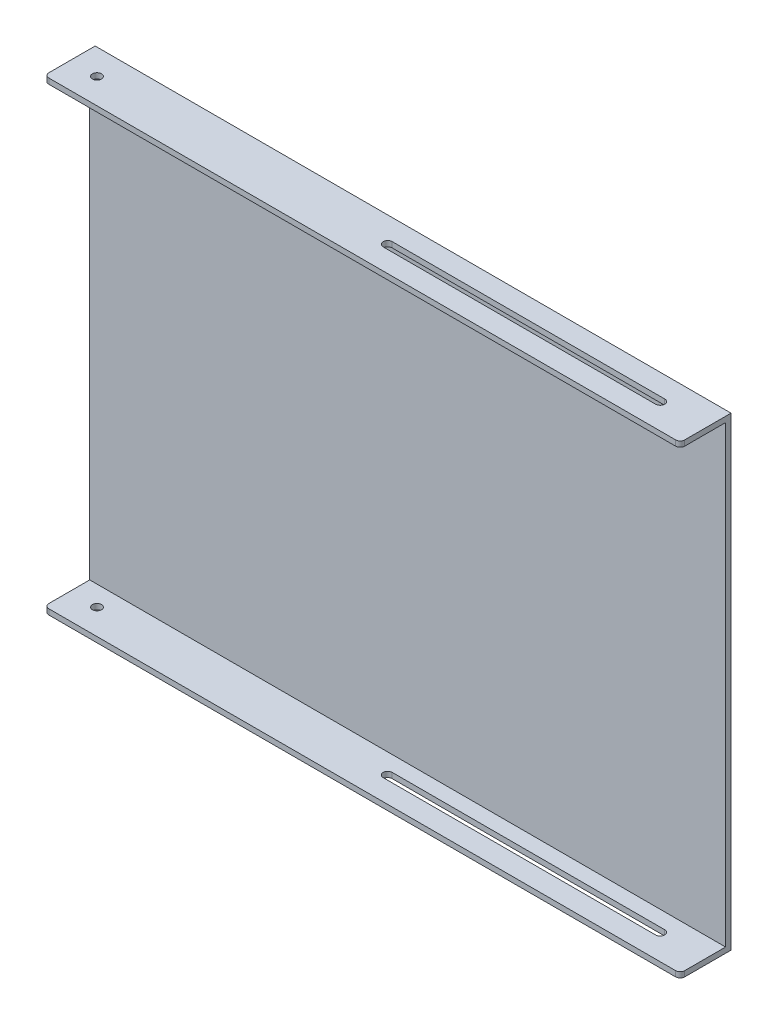
ISO-10303-21;
HEADER;
FILE_DESCRIPTION(('STEP AP214'),'2;1');
FILE_NAME('part.step','',(''),(''),'','','');
FILE_SCHEMA(('AUTOMOTIVE_DESIGN { 1 0 10303 214 1 1 1 1 }'));
ENDSEC;
DATA;
#1=APPLICATION_CONTEXT('core data for automotive mechanical design processes');
#2=APPLICATION_PROTOCOL_DEFINITION('international standard','automotive_design',2000,#1);
#3=PRODUCT_CONTEXT('',#1,'mechanical');
#4=PRODUCT('Part','Part','',(#3));
#5=PRODUCT_RELATED_PRODUCT_CATEGORY('part','',(#4));
#6=PRODUCT_DEFINITION_FORMATION('','',#4);
#7=PRODUCT_DEFINITION_CONTEXT('part definition',#1,'design');
#8=PRODUCT_DEFINITION('design','',#6,#7);
#9=PRODUCT_DEFINITION_SHAPE('','',#8);
#10=(LENGTH_UNIT() NAMED_UNIT(*) SI_UNIT(.MILLI.,.METRE.));
#11=(NAMED_UNIT(*) PLANE_ANGLE_UNIT() SI_UNIT($,.RADIAN.));
#12=(NAMED_UNIT(*) SI_UNIT($,.STERADIAN.) SOLID_ANGLE_UNIT());
#13=UNCERTAINTY_MEASURE_WITH_UNIT(LENGTH_MEASURE(1.E-05),#10,'distance_accuracy_value','');
#14=(GEOMETRIC_REPRESENTATION_CONTEXT(3) GLOBAL_UNCERTAINTY_ASSIGNED_CONTEXT((#13)) GLOBAL_UNIT_ASSIGNED_CONTEXT((#10,
#11,#12)) REPRESENTATION_CONTEXT('',''));
#15=CARTESIAN_POINT('',(0.,0.,0.));
#16=DIRECTION('',(0.,0.,1.));
#17=DIRECTION('',(1.,0.,0.));
#18=AXIS2_PLACEMENT_3D('',#15,#16,#17);
#19=CARTESIAN_POINT('',(-345.,256.,23.));
#20=DIRECTION('',(0.,-1.,0.));
#21=DIRECTION('',(0.,0.,-1.));
#22=AXIS2_PLACEMENT_3D('',#19,#20,#21);
#23=CYLINDRICAL_SURFACE('',#22,5.);
#24=DIRECTION('',(0.,-1.,0.));
#25=VECTOR('',#24,1.);
#26=CARTESIAN_POINT('',(-345.,256.,28.));
#27=LINE('',#26,#25);
#28=CARTESIAN_POINT('',(-345.,-250.,27.9999999999999));
#29=VERTEX_POINT('',#28);
#30=CARTESIAN_POINT('',(-345.,-256.,28.));
#31=VERTEX_POINT('',#30);
#32=EDGE_CURVE('E314',#29,#31,#27,.T.);
#33=ORIENTED_EDGE('',*,*,#32,.F.);
#34=CARTESIAN_POINT('',(-345.,-250.,23.));
#35=DIRECTION('',(0.,-1.,0.));
#36=DIRECTION('',(0.,0.,-1.));
#37=AXIS2_PLACEMENT_3D('',#34,#35,#36);
#38=CIRCLE('',#37,5.);
#39=CARTESIAN_POINT('',(-350.,-250.,23.));
#40=VERTEX_POINT('',#39);
#41=EDGE_CURVE('E227',#29,#40,#38,.T.);
#42=ORIENTED_EDGE('',*,*,#41,.T.);
#43=DIRECTION('',(0.,-1.,0.));
#44=VECTOR('',#43,1.);
#45=CARTESIAN_POINT('',(-350.,256.,23.));
#46=LINE('',#45,#44);
#47=CARTESIAN_POINT('',(-350.,-256.,23.));
#48=VERTEX_POINT('',#47);
#49=EDGE_CURVE('E187',#40,#48,#46,.T.);
#50=ORIENTED_EDGE('',*,*,#49,.T.);
#51=CARTESIAN_POINT('',(-345.,-256.,23.));
#52=DIRECTION('',(0.,1.,0.));
#53=DIRECTION('',(0.,0.,-1.));
#54=AXIS2_PLACEMENT_3D('',#51,#52,#53);
#55=CIRCLE('',#54,5.);
#56=EDGE_CURVE('E289',#48,#31,#55,.T.);
#57=ORIENTED_EDGE('',*,*,#56,.T.);
#58=EDGE_LOOP('',(#33,#42,#50,#57));
#59=FACE_BOUND('',#58,.T.);
#60=ADVANCED_FACE('F33',(#59),#23,.T.);
#61=CARTESIAN_POINT('',(-345.,256.,28.));
#62=DIRECTION('',(0.,0.,-1.));
#63=DIRECTION('',(-1.,0.,0.));
#64=AXIS2_PLACEMENT_3D('',#61,#62,#63);
#65=PLANE('',#64);
#66=DIRECTION('',(0.,-1.,0.));
#67=VECTOR('',#66,1.);
#68=CARTESIAN_POINT('',(345.,256.,28.));
#69=LINE('',#68,#67);
#70=CARTESIAN_POINT('',(345.,-250.,27.9999999999999));
#71=VERTEX_POINT('',#70);
#72=CARTESIAN_POINT('',(345.,-256.,28.));
#73=VERTEX_POINT('',#72);
#74=EDGE_CURVE('E310',#71,#73,#69,.T.);
#75=ORIENTED_EDGE('',*,*,#74,.F.);
#76=DIRECTION('',(1.,0.,0.));
#77=VECTOR('',#76,1.);
#78=CARTESIAN_POINT('',(-350.,-250.,27.9999999999999));
#79=LINE('',#78,#77);
#80=EDGE_CURVE('E191',#29,#71,#79,.T.);
#81=ORIENTED_EDGE('',*,*,#80,.F.);
#82=ORIENTED_EDGE('',*,*,#32,.T.);
#83=DIRECTION('',(1.,0.,0.));
#84=VECTOR('',#83,1.);
#85=CARTESIAN_POINT('',(-345.,-256.,28.));
#86=LINE('',#85,#84);
#87=EDGE_CURVE('E292',#31,#73,#86,.T.);
#88=ORIENTED_EDGE('',*,*,#87,.T.);
#89=EDGE_LOOP('',(#75,#81,#82,#88));
#90=FACE_BOUND('',#89,.T.);
#91=ADVANCED_FACE('F348',(#90),#65,.F.);
#92=CARTESIAN_POINT('',(345.,256.,23.));
#93=DIRECTION('',(0.,-1.,0.));
#94=DIRECTION('',(0.,0.,-1.));
#95=AXIS2_PLACEMENT_3D('',#92,#93,#94);
#96=CYLINDRICAL_SURFACE('',#95,5.);
#97=DIRECTION('',(0.,-1.,0.));
#98=VECTOR('',#97,1.);
#99=CARTESIAN_POINT('',(350.,256.,23.));
#100=LINE('',#99,#98);
#101=CARTESIAN_POINT('',(350.,-250.,23.));
#102=VERTEX_POINT('',#101);
#103=CARTESIAN_POINT('',(350.,-256.,23.));
#104=VERTEX_POINT('',#103);
#105=EDGE_CURVE('E306',#102,#104,#100,.T.);
#106=ORIENTED_EDGE('',*,*,#105,.F.);
#107=CARTESIAN_POINT('',(345.,-250.,23.));
#108=DIRECTION('',(0.,-1.,0.));
#109=DIRECTION('',(0.,0.,-1.));
#110=AXIS2_PLACEMENT_3D('',#107,#108,#109);
#111=CIRCLE('',#110,5.);
#112=EDGE_CURVE('E224',#102,#71,#111,.T.);
#113=ORIENTED_EDGE('',*,*,#112,.T.);
#114=ORIENTED_EDGE('',*,*,#74,.T.);
#115=CARTESIAN_POINT('',(345.,-256.,23.));
#116=DIRECTION('',(0.,1.,0.));
#117=DIRECTION('',(0.,0.,1.));
#118=AXIS2_PLACEMENT_3D('',#115,#116,#117);
#119=CIRCLE('',#118,5.);
#120=EDGE_CURVE('E295',#73,#104,#119,.T.);
#121=ORIENTED_EDGE('',*,*,#120,.T.);
#122=EDGE_LOOP('',(#106,#113,#114,#121));
#123=FACE_BOUND('',#122,.T.);
#124=ADVANCED_FACE('F353',(#123),#96,.T.);
#125=CARTESIAN_POINT('',(0.,256.,0.));
#126=DIRECTION('',(0.,-1.,0.));
#127=DIRECTION('',(0.,0.,-1.));
#128=AXIS2_PLACEMENT_3D('',#125,#126,#127);
#129=CYLINDRICAL_SURFACE('',#128,5.);
#130=CARTESIAN_POINT('',(0.,-250.,0.));
#131=DIRECTION('',(0.,-1.,0.));
#132=DIRECTION('',(0.,0.,-1.));
#133=AXIS2_PLACEMENT_3D('',#130,#131,#132);
#134=CIRCLE('',#133,5.);
#135=CARTESIAN_POINT('',(0.,-250.,5.));
#136=VERTEX_POINT('',#135);
#137=CARTESIAN_POINT('',(0.,-250.,-5.));
#138=VERTEX_POINT('',#137);
#139=EDGE_CURVE('E56',#136,#138,#134,.T.);
#140=ORIENTED_EDGE('',*,*,#139,.F.);
#141=DIRECTION('',(0.,-1.,0.));
#142=VECTOR('',#141,1.);
#143=CARTESIAN_POINT('',(0.,256.,5.));
#144=LINE('',#143,#142);
#145=CARTESIAN_POINT('',(0.,-256.,5.));
#146=VERTEX_POINT('',#145);
#147=EDGE_CURVE('E268',#136,#146,#144,.T.);
#148=ORIENTED_EDGE('',*,*,#147,.T.);
#149=CARTESIAN_POINT('',(0.,-256.,0.));
#150=DIRECTION('',(0.,1.,0.));
#151=DIRECTION('',(0.,0.,1.));
#152=AXIS2_PLACEMENT_3D('',#149,#150,#151);
#153=CIRCLE('',#152,5.);
#154=CARTESIAN_POINT('',(0.,-256.,-5.));
#155=VERTEX_POINT('',#154);
#156=EDGE_CURVE('E233',#155,#146,#153,.T.);
#157=ORIENTED_EDGE('',*,*,#156,.F.);
#158=DIRECTION('',(0.,-1.,0.));
#159=VECTOR('',#158,1.);
#160=CARTESIAN_POINT('',(0.,256.,-5.));
#161=LINE('',#160,#159);
#162=EDGE_CURVE('E246',#138,#155,#161,.T.);
#163=ORIENTED_EDGE('',*,*,#162,.F.);
#164=EDGE_LOOP('',(#140,#148,#157,#163));
#165=FACE_BOUND('',#164,.T.);
#166=ADVANCED_FACE('F405',(#165),#129,.F.);
#167=CARTESIAN_POINT('',(0.,256.,5.));
#168=DIRECTION('',(0.,0.,-1.));
#169=DIRECTION('',(-1.,0.,0.));
#170=AXIS2_PLACEMENT_3D('',#167,#168,#169);
#171=PLANE('',#170);
#172=DIRECTION('',(-1.,0.,0.));
#173=VECTOR('',#172,1.);
#174=CARTESIAN_POINT('',(0.,-250.,5.));
#175=LINE('',#174,#173);
#176=CARTESIAN_POINT('',(300.,-250.,5.));
#177=VERTEX_POINT('',#176);
#178=EDGE_CURVE('E220',#177,#136,#175,.T.);
#179=ORIENTED_EDGE('',*,*,#178,.F.);
#180=DIRECTION('',(0.,-1.,0.));
#181=VECTOR('',#180,1.);
#182=CARTESIAN_POINT('',(300.,256.,5.));
#183=LINE('',#182,#181);
#184=CARTESIAN_POINT('',(300.,-256.,5.));
#185=VERTEX_POINT('',#184);
#186=EDGE_CURVE('E264',#177,#185,#183,.T.);
#187=ORIENTED_EDGE('',*,*,#186,.T.);
#188=DIRECTION('',(1.,0.,0.));
#189=VECTOR('',#188,1.);
#190=CARTESIAN_POINT('',(0.,-256.,5.));
#191=LINE('',#190,#189);
#192=EDGE_CURVE('E249',#146,#185,#191,.T.);
#193=ORIENTED_EDGE('',*,*,#192,.F.);
#194=ORIENTED_EDGE('',*,*,#147,.F.);
#195=EDGE_LOOP('',(#179,#187,#193,#194));
#196=FACE_BOUND('',#195,.T.);
#197=ADVANCED_FACE('F409',(#196),#171,.T.);
#198=CARTESIAN_POINT('',(300.,256.,0.));
#199=DIRECTION('',(0.,-1.,0.));
#200=DIRECTION('',(0.,0.,-1.));
#201=AXIS2_PLACEMENT_3D('',#198,#199,#200);
#202=CYLINDRICAL_SURFACE('',#201,5.);
#203=CARTESIAN_POINT('',(300.,-250.,0.));
#204=DIRECTION('',(0.,-1.,0.));
#205=DIRECTION('',(0.,0.,-1.));
#206=AXIS2_PLACEMENT_3D('',#203,#204,#205);
#207=CIRCLE('',#206,5.);
#208=CARTESIAN_POINT('',(300.,-250.,-5.));
#209=VERTEX_POINT('',#208);
#210=EDGE_CURVE('E218',#209,#177,#207,.T.);
#211=ORIENTED_EDGE('',*,*,#210,.F.);
#212=DIRECTION('',(0.,-1.,0.));
#213=VECTOR('',#212,1.);
#214=CARTESIAN_POINT('',(300.,256.,-5.));
#215=LINE('',#214,#213);
#216=CARTESIAN_POINT('',(300.,-256.,-5.));
#217=VERTEX_POINT('',#216);
#218=EDGE_CURVE('E260',#209,#217,#215,.T.);
#219=ORIENTED_EDGE('',*,*,#218,.T.);
#220=CARTESIAN_POINT('',(300.,-256.,0.));
#221=DIRECTION('',(0.,1.,0.));
#222=DIRECTION('',(0.,0.,1.));
#223=AXIS2_PLACEMENT_3D('',#220,#221,#222);
#224=CIRCLE('',#223,5.);
#225=EDGE_CURVE('E252',#185,#217,#224,.T.);
#226=ORIENTED_EDGE('',*,*,#225,.F.);
#227=ORIENTED_EDGE('',*,*,#186,.F.);
#228=EDGE_LOOP('',(#211,#219,#226,#227));
#229=FACE_BOUND('',#228,.T.);
#230=ADVANCED_FACE('F415',(#229),#202,.F.);
#231=CARTESIAN_POINT('',(0.,256.,-5.));
#232=DIRECTION('',(0.,0.,1.));
#233=DIRECTION('',(1.,0.,0.));
#234=AXIS2_PLACEMENT_3D('',#231,#232,#233);
#235=PLANE('',#234);
#236=DIRECTION('',(1.,0.,0.));
#237=VECTOR('',#236,1.);
#238=CARTESIAN_POINT('',(0.,-250.,-5.));
#239=LINE('',#238,#237);
#240=EDGE_CURVE('E216',#138,#209,#239,.T.);
#241=ORIENTED_EDGE('',*,*,#240,.F.);
#242=ORIENTED_EDGE('',*,*,#162,.T.);
#243=DIRECTION('',(-1.,0.,0.));
#244=VECTOR('',#243,1.);
#245=CARTESIAN_POINT('',(0.,-256.,-5.));
#246=LINE('',#245,#244);
#247=EDGE_CURVE('E239',#217,#155,#246,.T.);
#248=ORIENTED_EDGE('',*,*,#247,.F.);
#249=ORIENTED_EDGE('',*,*,#218,.F.);
#250=EDGE_LOOP('',(#241,#242,#248,#249));
#251=FACE_BOUND('',#250,.T.);
#252=ADVANCED_FACE('F329',(#251),#235,.T.);
#253=CARTESIAN_POINT('',(-320.,256.,0.));
#254=DIRECTION('',(0.,-1.,0.));
#255=DIRECTION('',(0.,0.,-1.));
#256=AXIS2_PLACEMENT_3D('',#253,#254,#255);
#257=CYLINDRICAL_SURFACE('',#256,4.99999999999999);
#258=CARTESIAN_POINT('',(-320.,-250.,0.));
#259=DIRECTION('',(0.,-1.,0.));
#260=DIRECTION('',(0.,0.,-1.));
#261=AXIS2_PLACEMENT_3D('',#258,#259,#260);
#262=CIRCLE('',#261,4.99999999999999);
#263=CARTESIAN_POINT('',(-320.,-250.,-4.99999999999999));
#264=VERTEX_POINT('',#263);
#265=EDGE_CURVE('E215',#264,#264,#262,.T.);
#266=ORIENTED_EDGE('',*,*,#265,.F.);
#267=EDGE_LOOP('',(#266));
#268=FACE_BOUND('',#267,.T.);
#269=CARTESIAN_POINT('',(-320.,-256.,0.));
#270=DIRECTION('',(0.,1.,0.));
#271=DIRECTION('',(0.,0.,1.));
#272=AXIS2_PLACEMENT_3D('',#269,#270,#271);
#273=CIRCLE('',#272,4.99999999999999);
#274=CARTESIAN_POINT('',(-320.,-256.,4.99999999999999));
#275=VERTEX_POINT('',#274);
#276=EDGE_CURVE('E229',#275,#275,#273,.T.);
#277=ORIENTED_EDGE('',*,*,#276,.F.);
#278=EDGE_LOOP('',(#277));
#279=FACE_BOUND('',#278,.T.);
#280=ADVANCED_FACE('F325',(#268,#279),#257,.F.);
#281=CARTESIAN_POINT('',(-345.,256.,23.));
#282=DIRECTION('',(0.,-1.,0.));
#283=DIRECTION('',(0.,0.,-1.));
#284=AXIS2_PLACEMENT_3D('',#281,#282,#283);
#285=PLANE('',#284);
#286=DIRECTION('',(0.,0.,1.));
#287=VECTOR('',#286,1.);
#288=CARTESIAN_POINT('',(-350.,256.,-28.));
#289=LINE('',#288,#287);
#290=CARTESIAN_POINT('',(-350.,256.,-28.));
#291=VERTEX_POINT('',#290);
#292=CARTESIAN_POINT('',(-350.,256.,23.));
#293=VERTEX_POINT('',#292);
#294=EDGE_CURVE('E273',#291,#293,#289,.T.);
#295=ORIENTED_EDGE('',*,*,#294,.T.);
#296=CARTESIAN_POINT('',(-345.,256.,23.));
#297=DIRECTION('',(0.,1.,0.));
#298=DIRECTION('',(0.,0.,-1.));
#299=AXIS2_PLACEMENT_3D('',#296,#297,#298);
#300=CIRCLE('',#299,5.);
#301=CARTESIAN_POINT('',(-345.,256.,28.));
#302=VERTEX_POINT('',#301);
#303=EDGE_CURVE('E276',#293,#302,#300,.T.);
#304=ORIENTED_EDGE('',*,*,#303,.T.);
#305=DIRECTION('',(1.,0.,0.));
#306=VECTOR('',#305,1.);
#307=CARTESIAN_POINT('',(-345.,256.,28.));
#308=LINE('',#307,#306);
#309=CARTESIAN_POINT('',(345.,256.,28.));
#310=VERTEX_POINT('',#309);
#311=EDGE_CURVE('E279',#302,#310,#308,.T.);
#312=ORIENTED_EDGE('',*,*,#311,.T.);
#313=CARTESIAN_POINT('',(345.,256.,23.));
#314=DIRECTION('',(0.,1.,0.));
#315=DIRECTION('',(0.,0.,1.));
#316=AXIS2_PLACEMENT_3D('',#313,#314,#315);
#317=CIRCLE('',#316,5.);
#318=CARTESIAN_POINT('',(350.,256.,23.));
#319=VERTEX_POINT('',#318);
#320=EDGE_CURVE('E281',#310,#319,#317,.T.);
#321=ORIENTED_EDGE('',*,*,#320,.T.);
#322=DIRECTION('',(0.,0.,-1.));
#323=VECTOR('',#322,1.);
#324=CARTESIAN_POINT('',(350.,256.,-28.));
#325=LINE('',#324,#323);
#326=CARTESIAN_POINT('',(350.,256.,-28.));
#327=VERTEX_POINT('',#326);
#328=EDGE_CURVE('E283',#319,#327,#325,.T.);
#329=ORIENTED_EDGE('',*,*,#328,.T.);
#330=DIRECTION('',(-1.,0.,0.));
#331=VECTOR('',#330,1.);
#332=CARTESIAN_POINT('',(-350.,256.,-28.));
#333=LINE('',#332,#331);
#334=EDGE_CURVE('E285',#327,#291,#333,.T.);
#335=ORIENTED_EDGE('',*,*,#334,.T.);
#336=EDGE_LOOP('',(#295,#304,#312,#321,#329,#335));
#337=FACE_BOUND('',#336,.T.);
#338=CARTESIAN_POINT('',(0.,256.,0.));
#339=DIRECTION('',(0.,1.,0.));
#340=DIRECTION('',(0.,0.,1.));
#341=AXIS2_PLACEMENT_3D('',#338,#339,#340);
#342=CIRCLE('',#341,5.);
#343=CARTESIAN_POINT('',(0.,256.,-5.));
#344=VERTEX_POINT('',#343);
#345=CARTESIAN_POINT('',(0.,256.,5.));
#346=VERTEX_POINT('',#345);
#347=EDGE_CURVE('E236',#344,#346,#342,.T.);
#348=ORIENTED_EDGE('',*,*,#347,.F.);
#349=DIRECTION('',(-1.,0.,0.));
#350=VECTOR('',#349,1.);
#351=CARTESIAN_POINT('',(0.,256.,-5.));
#352=LINE('',#351,#350);
#353=CARTESIAN_POINT('',(300.,256.,-5.));
#354=VERTEX_POINT('',#353);
#355=EDGE_CURVE('E244',#354,#344,#352,.T.);
#356=ORIENTED_EDGE('',*,*,#355,.F.);
#357=CARTESIAN_POINT('',(300.,256.,0.));
#358=DIRECTION('',(0.,1.,0.));
#359=DIRECTION('',(0.,0.,1.));
#360=AXIS2_PLACEMENT_3D('',#357,#358,#359);
#361=CIRCLE('',#360,5.);
#362=CARTESIAN_POINT('',(300.,256.,5.));
#363=VERTEX_POINT('',#362);
#364=EDGE_CURVE('E241',#363,#354,#361,.T.);
#365=ORIENTED_EDGE('',*,*,#364,.F.);
#366=DIRECTION('',(1.,0.,0.));
#367=VECTOR('',#366,1.);
#368=CARTESIAN_POINT('',(0.,256.,5.));
#369=LINE('',#368,#367);
#370=EDGE_CURVE('E238',#346,#363,#369,.T.);
#371=ORIENTED_EDGE('',*,*,#370,.F.);
#372=EDGE_LOOP('',(#348,#356,#365,#371));
#373=FACE_BOUND('',#372,.T.);
#374=CARTESIAN_POINT('',(-320.,256.,0.));
#375=DIRECTION('',(0.,1.,0.));
#376=DIRECTION('',(0.,0.,1.));
#377=AXIS2_PLACEMENT_3D('',#374,#375,#376);
#378=CIRCLE('',#377,4.99999999999999);
#379=CARTESIAN_POINT('',(-320.,256.,4.99999999999999));
#380=VERTEX_POINT('',#379);
#381=EDGE_CURVE('E230',#380,#380,#378,.T.);
#382=ORIENTED_EDGE('',*,*,#381,.F.);
#383=EDGE_LOOP('',(#382));
#384=FACE_BOUND('',#383,.T.);
#385=ADVANCED_FACE('F328',(#337,#373,#384),#285,.F.);
#386=CARTESIAN_POINT('',(-345.,-256.,23.));
#387=DIRECTION('',(0.,-1.,0.));
#388=DIRECTION('',(0.,0.,-1.));
#389=AXIS2_PLACEMENT_3D('',#386,#387,#388);
#390=PLANE('',#389);
#391=ORIENTED_EDGE('',*,*,#247,.T.);
#392=ORIENTED_EDGE('',*,*,#156,.T.);
#393=ORIENTED_EDGE('',*,*,#192,.T.);
#394=ORIENTED_EDGE('',*,*,#225,.T.);
#395=EDGE_LOOP('',(#391,#392,#393,#394));
#396=FACE_BOUND('',#395,.T.);
#397=DIRECTION('',(0.,0.,1.));
#398=VECTOR('',#397,1.);
#399=CARTESIAN_POINT('',(-350.,-256.,-28.));
#400=LINE('',#399,#398);
#401=CARTESIAN_POINT('',(-350.,-256.,-28.));
#402=VERTEX_POINT('',#401);
#403=EDGE_CURVE('E272',#402,#48,#400,.T.);
#404=ORIENTED_EDGE('',*,*,#403,.F.);
#405=DIRECTION('',(-1.,0.,0.));
#406=VECTOR('',#405,1.);
#407=CARTESIAN_POINT('',(-350.,-256.,-28.));
#408=LINE('',#407,#406);
#409=CARTESIAN_POINT('',(350.,-256.,-28.));
#410=VERTEX_POINT('',#409);
#411=EDGE_CURVE('E277',#410,#402,#408,.T.);
#412=ORIENTED_EDGE('',*,*,#411,.F.);
#413=DIRECTION('',(0.,0.,-1.));
#414=VECTOR('',#413,1.);
#415=CARTESIAN_POINT('',(350.,-256.,-28.));
#416=LINE('',#415,#414);
#417=EDGE_CURVE('E298',#104,#410,#416,.T.);
#418=ORIENTED_EDGE('',*,*,#417,.F.);
#419=ORIENTED_EDGE('',*,*,#120,.F.);
#420=ORIENTED_EDGE('',*,*,#87,.F.);
#421=ORIENTED_EDGE('',*,*,#56,.F.);
#422=EDGE_LOOP('',(#404,#412,#418,#419,#420,#421));
#423=FACE_BOUND('',#422,.T.);
#424=ORIENTED_EDGE('',*,*,#276,.T.);
#425=EDGE_LOOP('',(#424));
#426=FACE_BOUND('',#425,.T.);
#427=ADVANCED_FACE('F334',(#396,#423,#426),#390,.T.);
#428=CARTESIAN_POINT('',(-350.,256.,-28.));
#429=DIRECTION('',(1.,0.,0.));
#430=DIRECTION('',(0.,0.,-1.));
#431=AXIS2_PLACEMENT_3D('',#428,#429,#430);
#432=PLANE('',#431);
#433=ORIENTED_EDGE('',*,*,#49,.F.);
#434=DIRECTION('',(0.,0.,-1.));
#435=VECTOR('',#434,1.);
#436=CARTESIAN_POINT('',(-350.,-250.,27.9999999999999));
#437=LINE('',#436,#435);
#438=CARTESIAN_POINT('',(-350.,-250.,-22.));
#439=VERTEX_POINT('',#438);
#440=EDGE_CURVE('E170',#40,#439,#437,.T.);
#441=ORIENTED_EDGE('',*,*,#440,.T.);
#442=DIRECTION('',(0.,1.,0.));
#443=VECTOR('',#442,1.);
#444=CARTESIAN_POINT('',(-350.,-250.,-22.));
#445=LINE('',#444,#443);
#446=CARTESIAN_POINT('',(-350.,250.,-22.));
#447=VERTEX_POINT('',#446);
#448=EDGE_CURVE('E178',#439,#447,#445,.T.);
#449=ORIENTED_EDGE('',*,*,#448,.T.);
#450=DIRECTION('',(0.,0.,1.));
#451=VECTOR('',#450,1.);
#452=CARTESIAN_POINT('',(-350.,250.,-22.));
#453=LINE('',#452,#451);
#454=CARTESIAN_POINT('',(-350.,250.,23.));
#455=VERTEX_POINT('',#454);
#456=EDGE_CURVE('E175',#447,#455,#453,.T.);
#457=ORIENTED_EDGE('',*,*,#456,.T.);
#458=EDGE_CURVE('E41',#293,#455,#46,.T.);
#459=ORIENTED_EDGE('',*,*,#458,.F.);
#460=ORIENTED_EDGE('',*,*,#294,.F.);
#461=DIRECTION('',(0.,-1.,0.));
#462=VECTOR('',#461,1.);
#463=CARTESIAN_POINT('',(-350.,256.,-28.));
#464=LINE('',#463,#462);
#465=EDGE_CURVE('E287',#291,#402,#464,.T.);
#466=ORIENTED_EDGE('',*,*,#465,.T.);
#467=ORIENTED_EDGE('',*,*,#403,.T.);
#468=EDGE_LOOP('',(#433,#441,#449,#457,#459,#460,#466,#467));
#469=FACE_BOUND('',#468,.T.);
#470=ADVANCED_FACE('F35',(#469),#432,.F.);
#471=ORIENTED_EDGE('',*,*,#458,.T.);
#472=CARTESIAN_POINT('',(-345.,250.,23.));
#473=DIRECTION('',(0.,1.,0.));
#474=DIRECTION('',(0.,0.,1.));
#475=AXIS2_PLACEMENT_3D('',#472,#473,#474);
#476=CIRCLE('',#475,5.);
#477=CARTESIAN_POINT('',(-345.,250.,28.0000000000001));
#478=VERTEX_POINT('',#477);
#479=EDGE_CURVE('E212',#455,#478,#476,.T.);
#480=ORIENTED_EDGE('',*,*,#479,.T.);
#481=EDGE_CURVE('E315',#302,#478,#27,.T.);
#482=ORIENTED_EDGE('',*,*,#481,.F.);
#483=ORIENTED_EDGE('',*,*,#303,.F.);
#484=EDGE_LOOP('',(#471,#480,#482,#483));
#485=FACE_BOUND('',#484,.T.);
#486=ADVANCED_FACE('F342',(#485),#23,.T.);
#487=ORIENTED_EDGE('',*,*,#481,.T.);
#488=DIRECTION('',(1.,0.,0.));
#489=VECTOR('',#488,1.);
#490=CARTESIAN_POINT('',(-350.,250.,28.0000000000001));
#491=LINE('',#490,#489);
#492=CARTESIAN_POINT('',(345.,250.,28.0000000000001));
#493=VERTEX_POINT('',#492);
#494=EDGE_CURVE('E194',#478,#493,#491,.T.);
#495=ORIENTED_EDGE('',*,*,#494,.T.);
#496=EDGE_CURVE('E311',#310,#493,#69,.T.);
#497=ORIENTED_EDGE('',*,*,#496,.F.);
#498=ORIENTED_EDGE('',*,*,#311,.F.);
#499=EDGE_LOOP('',(#487,#495,#497,#498));
#500=FACE_BOUND('',#499,.T.);
#501=ADVANCED_FACE('F356',(#500),#65,.F.);
#502=ORIENTED_EDGE('',*,*,#496,.T.);
#503=CARTESIAN_POINT('',(345.,250.,23.));
#504=DIRECTION('',(0.,1.,0.));
#505=DIRECTION('',(0.,0.,1.));
#506=AXIS2_PLACEMENT_3D('',#503,#504,#505);
#507=CIRCLE('',#506,5.);
#508=CARTESIAN_POINT('',(350.,250.,23.));
#509=VERTEX_POINT('',#508);
#510=EDGE_CURVE('E209',#493,#509,#507,.T.);
#511=ORIENTED_EDGE('',*,*,#510,.T.);
#512=EDGE_CURVE('E307',#319,#509,#100,.T.);
#513=ORIENTED_EDGE('',*,*,#512,.F.);
#514=ORIENTED_EDGE('',*,*,#320,.F.);
#515=EDGE_LOOP('',(#502,#511,#513,#514));
#516=FACE_BOUND('',#515,.T.);
#517=ADVANCED_FACE('F363',(#516),#96,.T.);
#518=CARTESIAN_POINT('',(350.,256.,-28.));
#519=DIRECTION('',(-1.,0.,0.));
#520=DIRECTION('',(0.,0.,1.));
#521=AXIS2_PLACEMENT_3D('',#518,#519,#520);
#522=PLANE('',#521);
#523=DIRECTION('',(0.,-1.,0.));
#524=VECTOR('',#523,1.);
#525=CARTESIAN_POINT('',(350.,256.,-22.));
#526=LINE('',#525,#524);
#527=CARTESIAN_POINT('',(350.,250.,-22.));
#528=VERTEX_POINT('',#527);
#529=CARTESIAN_POINT('',(350.,-250.,-22.));
#530=VERTEX_POINT('',#529);
#531=EDGE_CURVE('E11',#528,#530,#526,.T.);
#532=ORIENTED_EDGE('',*,*,#531,.T.);
#533=DIRECTION('',(0.,0.,1.));
#534=VECTOR('',#533,1.);
#535=CARTESIAN_POINT('',(350.,-250.,-28.));
#536=LINE('',#535,#534);
#537=EDGE_CURVE('E173',#530,#102,#536,.T.);
#538=ORIENTED_EDGE('',*,*,#537,.T.);
#539=ORIENTED_EDGE('',*,*,#105,.T.);
#540=ORIENTED_EDGE('',*,*,#417,.T.);
#541=DIRECTION('',(0.,-1.,0.));
#542=VECTOR('',#541,1.);
#543=CARTESIAN_POINT('',(350.,256.,-28.));
#544=LINE('',#543,#542);
#545=EDGE_CURVE('E303',#327,#410,#544,.T.);
#546=ORIENTED_EDGE('',*,*,#545,.F.);
#547=ORIENTED_EDGE('',*,*,#328,.F.);
#548=ORIENTED_EDGE('',*,*,#512,.T.);
#549=DIRECTION('',(0.,0.,-1.));
#550=VECTOR('',#549,1.);
#551=CARTESIAN_POINT('',(350.,250.,-28.));
#552=LINE('',#551,#550);
#553=EDGE_CURVE('E206',#509,#528,#552,.T.);
#554=ORIENTED_EDGE('',*,*,#553,.T.);
#555=EDGE_LOOP('',(#532,#538,#539,#540,#546,#547,#548,#554));
#556=FACE_BOUND('',#555,.T.);
#557=ADVANCED_FACE('F393',(#556),#522,.F.);
#558=CARTESIAN_POINT('',(-350.,256.,-28.));
#559=DIRECTION('',(0.,0.,1.));
#560=DIRECTION('',(1.,0.,0.));
#561=AXIS2_PLACEMENT_3D('',#558,#559,#560);
#562=PLANE('',#561);
#563=ORIENTED_EDGE('',*,*,#411,.T.);
#564=ORIENTED_EDGE('',*,*,#465,.F.);
#565=ORIENTED_EDGE('',*,*,#334,.F.);
#566=ORIENTED_EDGE('',*,*,#545,.T.);
#567=EDGE_LOOP('',(#563,#564,#565,#566));
#568=FACE_BOUND('',#567,.T.);
#569=ADVANCED_FACE('F381',(#568),#562,.F.);
#570=CARTESIAN_POINT('',(0.,250.,0.));
#571=DIRECTION('',(0.,1.,0.));
#572=DIRECTION('',(0.,0.,1.));
#573=AXIS2_PLACEMENT_3D('',#570,#571,#572);
#574=CIRCLE('',#573,5.);
#575=CARTESIAN_POINT('',(0.,250.,-5.));
#576=VERTEX_POINT('',#575);
#577=CARTESIAN_POINT('',(0.,250.,5.));
#578=VERTEX_POINT('',#577);
#579=EDGE_CURVE('E204',#576,#578,#574,.T.);
#580=ORIENTED_EDGE('',*,*,#579,.F.);
#581=EDGE_CURVE('E257',#344,#576,#161,.T.);
#582=ORIENTED_EDGE('',*,*,#581,.F.);
#583=ORIENTED_EDGE('',*,*,#347,.T.);
#584=EDGE_CURVE('E269',#346,#578,#144,.T.);
#585=ORIENTED_EDGE('',*,*,#584,.T.);
#586=EDGE_LOOP('',(#580,#582,#583,#585));
#587=FACE_BOUND('',#586,.T.);
#588=ADVANCED_FACE('F400',(#587),#129,.F.);
#589=DIRECTION('',(1.,0.,0.));
#590=VECTOR('',#589,1.);
#591=CARTESIAN_POINT('',(0.,250.,5.));
#592=LINE('',#591,#590);
#593=CARTESIAN_POINT('',(300.,250.,5.));
#594=VERTEX_POINT('',#593);
#595=EDGE_CURVE('E202',#578,#594,#592,.T.);
#596=ORIENTED_EDGE('',*,*,#595,.F.);
#597=ORIENTED_EDGE('',*,*,#584,.F.);
#598=ORIENTED_EDGE('',*,*,#370,.T.);
#599=EDGE_CURVE('E265',#363,#594,#183,.T.);
#600=ORIENTED_EDGE('',*,*,#599,.T.);
#601=EDGE_LOOP('',(#596,#597,#598,#600));
#602=FACE_BOUND('',#601,.T.);
#603=ADVANCED_FACE('F418',(#602),#171,.T.);
#604=CARTESIAN_POINT('',(300.,250.,0.));
#605=DIRECTION('',(0.,1.,0.));
#606=DIRECTION('',(0.,0.,1.));
#607=AXIS2_PLACEMENT_3D('',#604,#605,#606);
#608=CIRCLE('',#607,5.);
#609=CARTESIAN_POINT('',(300.,250.,-5.));
#610=VERTEX_POINT('',#609);
#611=EDGE_CURVE('E200',#594,#610,#608,.T.);
#612=ORIENTED_EDGE('',*,*,#611,.F.);
#613=ORIENTED_EDGE('',*,*,#599,.F.);
#614=ORIENTED_EDGE('',*,*,#364,.T.);
#615=EDGE_CURVE('E261',#354,#610,#215,.T.);
#616=ORIENTED_EDGE('',*,*,#615,.T.);
#617=EDGE_LOOP('',(#612,#613,#614,#616));
#618=FACE_BOUND('',#617,.T.);
#619=ADVANCED_FACE('F424',(#618),#202,.F.);
#620=DIRECTION('',(-1.,0.,0.));
#621=VECTOR('',#620,1.);
#622=CARTESIAN_POINT('',(0.,250.,-5.));
#623=LINE('',#622,#621);
#624=EDGE_CURVE('E198',#610,#576,#623,.T.);
#625=ORIENTED_EDGE('',*,*,#624,.F.);
#626=ORIENTED_EDGE('',*,*,#615,.F.);
#627=ORIENTED_EDGE('',*,*,#355,.T.);
#628=ORIENTED_EDGE('',*,*,#581,.T.);
#629=EDGE_LOOP('',(#625,#626,#627,#628));
#630=FACE_BOUND('',#629,.T.);
#631=ADVANCED_FACE('F434',(#630),#235,.T.);
#632=CARTESIAN_POINT('',(-320.,250.,0.));
#633=DIRECTION('',(0.,1.,0.));
#634=DIRECTION('',(0.,0.,1.));
#635=AXIS2_PLACEMENT_3D('',#632,#633,#634);
#636=CIRCLE('',#635,4.99999999999999);
#637=CARTESIAN_POINT('',(-320.,250.,4.99999999999999));
#638=VERTEX_POINT('',#637);
#639=EDGE_CURVE('E193',#638,#638,#636,.T.);
#640=ORIENTED_EDGE('',*,*,#639,.F.);
#641=EDGE_LOOP('',(#640));
#642=FACE_BOUND('',#641,.T.);
#643=ORIENTED_EDGE('',*,*,#381,.T.);
#644=EDGE_LOOP('',(#643));
#645=FACE_BOUND('',#644,.T.);
#646=ADVANCED_FACE('F331',(#642,#645),#257,.F.);
#647=CARTESIAN_POINT('',(-350.,-250.,-22.));
#648=DIRECTION('',(0.,0.,-1.));
#649=DIRECTION('',(0.,1.,0.));
#650=AXIS2_PLACEMENT_3D('',#647,#648,#649);
#651=PLANE('',#650);
#652=DIRECTION('',(1.,0.,0.));
#653=VECTOR('',#652,1.);
#654=CARTESIAN_POINT('',(-350.,250.,-22.));
#655=LINE('',#654,#653);
#656=EDGE_CURVE('E174',#447,#528,#655,.T.);
#657=ORIENTED_EDGE('',*,*,#656,.F.);
#658=ORIENTED_EDGE('',*,*,#448,.F.);
#659=DIRECTION('',(1.,0.,0.));
#660=VECTOR('',#659,1.);
#661=CARTESIAN_POINT('',(-350.,-250.,-22.));
#662=LINE('',#661,#660);
#663=EDGE_CURVE('E48',#439,#530,#662,.T.);
#664=ORIENTED_EDGE('',*,*,#663,.T.);
#665=ORIENTED_EDGE('',*,*,#531,.F.);
#666=EDGE_LOOP('',(#657,#658,#664,#665));
#667=FACE_BOUND('',#666,.T.);
#668=ADVANCED_FACE('F179',(#667),#651,.F.);
#669=CARTESIAN_POINT('',(-350.,-250.,27.9999999999999));
#670=DIRECTION('',(0.,-1.,0.));
#671=DIRECTION('',(0.,0.,-1.));
#672=AXIS2_PLACEMENT_3D('',#669,#670,#671);
#673=PLANE('',#672);
#674=ORIENTED_EDGE('',*,*,#139,.T.);
#675=ORIENTED_EDGE('',*,*,#240,.T.);
#676=ORIENTED_EDGE('',*,*,#210,.T.);
#677=ORIENTED_EDGE('',*,*,#178,.T.);
#678=EDGE_LOOP('',(#674,#675,#676,#677));
#679=FACE_BOUND('',#678,.T.);
#680=ORIENTED_EDGE('',*,*,#265,.T.);
#681=EDGE_LOOP('',(#680));
#682=FACE_BOUND('',#681,.T.);
#683=ORIENTED_EDGE('',*,*,#80,.T.);
#684=ORIENTED_EDGE('',*,*,#112,.F.);
#685=ORIENTED_EDGE('',*,*,#537,.F.);
#686=ORIENTED_EDGE('',*,*,#663,.F.);
#687=ORIENTED_EDGE('',*,*,#440,.F.);
#688=ORIENTED_EDGE('',*,*,#41,.F.);
#689=EDGE_LOOP('',(#683,#684,#685,#686,#687,#688));
#690=FACE_BOUND('',#689,.T.);
#691=ADVANCED_FACE('F168',(#679,#682,#690),#673,.F.);
#692=CARTESIAN_POINT('',(-350.,250.,-22.));
#693=DIRECTION('',(0.,1.,0.));
#694=DIRECTION('',(0.,0.,1.));
#695=AXIS2_PLACEMENT_3D('',#692,#693,#694);
#696=PLANE('',#695);
#697=ORIENTED_EDGE('',*,*,#579,.T.);
#698=ORIENTED_EDGE('',*,*,#595,.T.);
#699=ORIENTED_EDGE('',*,*,#611,.T.);
#700=ORIENTED_EDGE('',*,*,#624,.T.);
#701=EDGE_LOOP('',(#697,#698,#699,#700));
#702=FACE_BOUND('',#701,.T.);
#703=ORIENTED_EDGE('',*,*,#639,.T.);
#704=EDGE_LOOP('',(#703));
#705=FACE_BOUND('',#704,.T.);
#706=ORIENTED_EDGE('',*,*,#456,.F.);
#707=ORIENTED_EDGE('',*,*,#656,.T.);
#708=ORIENTED_EDGE('',*,*,#553,.F.);
#709=ORIENTED_EDGE('',*,*,#510,.F.);
#710=ORIENTED_EDGE('',*,*,#494,.F.);
#711=ORIENTED_EDGE('',*,*,#479,.F.);
#712=EDGE_LOOP('',(#706,#707,#708,#709,#710,#711));
#713=FACE_BOUND('',#712,.T.);
#714=ADVANCED_FACE('F369',(#702,#705,#713),#696,.F.);
#715=CLOSED_SHELL('',(#60,#91,#124,#166,#197,#230,#252,#280,#385,#427,#470,#486,#501,#517,#557,
#569,#588,#603,#619,#631,#646,#668,#691,#714));
#716=MANIFOLD_SOLID_BREP('B2',#715);
#717=ADVANCED_BREP_SHAPE_REPRESENTATION('',(#18,#716),#14);
#718=SHAPE_DEFINITION_REPRESENTATION(#9,#717);
ENDSEC;
END-ISO-10303-21;
